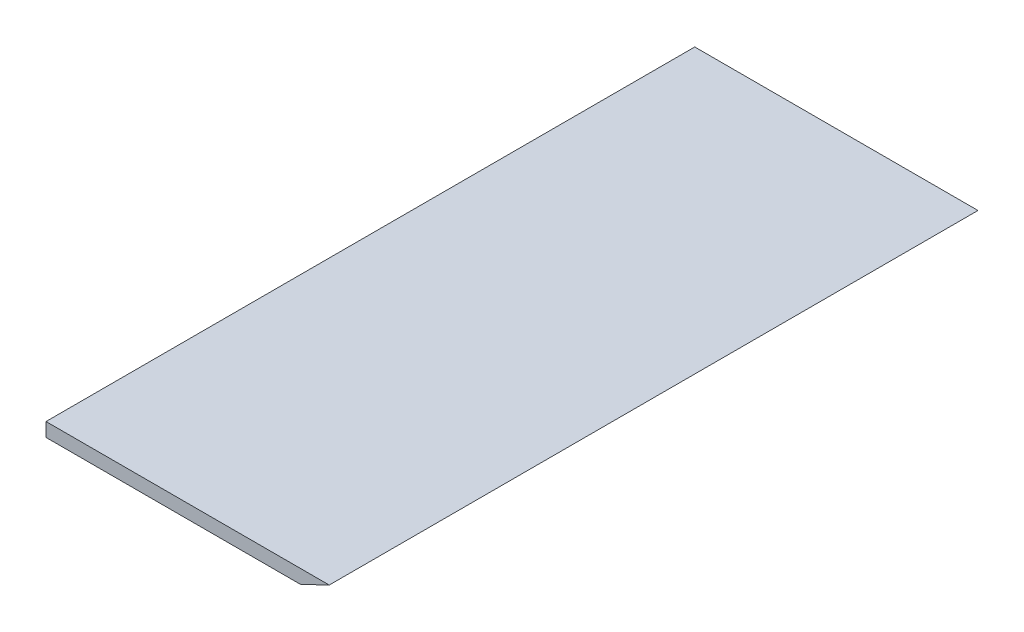
ISO-10303-21;
HEADER;
FILE_DESCRIPTION(('STEP AP214'),'2;1');
FILE_NAME('part.step','',(''),(''),'','','');
FILE_SCHEMA(('AUTOMOTIVE_DESIGN { 1 0 10303 214 1 1 1 1 }'));
ENDSEC;
DATA;
#1=APPLICATION_CONTEXT('core data for automotive mechanical design processes');
#2=APPLICATION_PROTOCOL_DEFINITION('international standard','automotive_design',2000,#1);
#3=PRODUCT_CONTEXT('',#1,'mechanical');
#4=PRODUCT('Part','Part','',(#3));
#5=PRODUCT_RELATED_PRODUCT_CATEGORY('part','',(#4));
#6=PRODUCT_DEFINITION_FORMATION('','',#4);
#7=PRODUCT_DEFINITION_CONTEXT('part definition',#1,'design');
#8=PRODUCT_DEFINITION('design','',#6,#7);
#9=PRODUCT_DEFINITION_SHAPE('','',#8);
#10=(LENGTH_UNIT() NAMED_UNIT(*) SI_UNIT(.MILLI.,.METRE.));
#11=(NAMED_UNIT(*) PLANE_ANGLE_UNIT() SI_UNIT($,.RADIAN.));
#12=(NAMED_UNIT(*) SI_UNIT($,.STERADIAN.) SOLID_ANGLE_UNIT());
#13=UNCERTAINTY_MEASURE_WITH_UNIT(LENGTH_MEASURE(1.E-05),#10,'distance_accuracy_value','');
#14=(GEOMETRIC_REPRESENTATION_CONTEXT(3) GLOBAL_UNCERTAINTY_ASSIGNED_CONTEXT((#13)) GLOBAL_UNIT_ASSIGNED_CONTEXT((#10,
#11,#12)) REPRESENTATION_CONTEXT('',''));
#15=CARTESIAN_POINT('',(0.,0.,0.));
#16=DIRECTION('',(0.,0.,1.));
#17=DIRECTION('',(1.,0.,0.));
#18=AXIS2_PLACEMENT_3D('',#15,#16,#17);
#19=CARTESIAN_POINT('',(0.,0.,298.45));
#20=DIRECTION('',(1.,0.,0.));
#21=DIRECTION('',(0.,0.,-1.));
#22=AXIS2_PLACEMENT_3D('',#19,#20,#21);
#23=PLANE('',#22);
#24=DIRECTION('',(0.,-1.,0.));
#25=VECTOR('',#24,1.);
#26=CARTESIAN_POINT('',(0.,0.,0.));
#27=LINE('',#26,#25);
#28=CARTESIAN_POINT('',(0.,6.35,0.));
#29=VERTEX_POINT('',#28);
#30=CARTESIAN_POINT('',(0.,0.,0.));
#31=VERTEX_POINT('',#30);
#32=EDGE_CURVE('E96',#29,#31,#27,.T.);
#33=ORIENTED_EDGE('',*,*,#32,.T.);
#34=DIRECTION('',(0.,0.,-1.));
#35=VECTOR('',#34,1.);
#36=CARTESIAN_POINT('',(0.,0.,298.45));
#37=LINE('',#36,#35);
#38=CARTESIAN_POINT('',(0.,0.,298.45));
#39=VERTEX_POINT('',#38);
#40=EDGE_CURVE('E11',#39,#31,#37,.T.);
#41=ORIENTED_EDGE('',*,*,#40,.F.);
#42=DIRECTION('',(0.,-1.,0.));
#43=VECTOR('',#42,1.);
#44=CARTESIAN_POINT('',(0.,0.,298.45));
#45=LINE('',#44,#43);
#46=CARTESIAN_POINT('',(0.,6.35,298.45));
#47=VERTEX_POINT('',#46);
#48=EDGE_CURVE('E84',#47,#39,#45,.T.);
#49=ORIENTED_EDGE('',*,*,#48,.F.);
#50=DIRECTION('',(0.,0.,-1.));
#51=VECTOR('',#50,1.);
#52=CARTESIAN_POINT('',(0.,6.35,298.45));
#53=LINE('',#52,#51);
#54=EDGE_CURVE('E92',#47,#29,#53,.T.);
#55=ORIENTED_EDGE('',*,*,#54,.T.);
#56=EDGE_LOOP('',(#33,#41,#49,#55));
#57=FACE_BOUND('',#56,.T.);
#58=ADVANCED_FACE('F33',(#57),#23,.F.);
#59=CARTESIAN_POINT('',(0.,0.,298.45));
#60=DIRECTION('',(0.,1.,0.));
#61=DIRECTION('',(0.,0.,1.));
#62=AXIS2_PLACEMENT_3D('',#59,#60,#61);
#63=PLANE('',#62);
#64=DIRECTION('',(1.,0.,0.));
#65=VECTOR('',#64,1.);
#66=CARTESIAN_POINT('',(0.,0.,0.));
#67=LINE('',#66,#65);
#68=CARTESIAN_POINT('',(117.094,0.,0.));
#69=VERTEX_POINT('',#68);
#70=EDGE_CURVE('E88',#31,#69,#67,.T.);
#71=ORIENTED_EDGE('',*,*,#70,.T.);
#72=DIRECTION('',(0.,0.,-1.));
#73=VECTOR('',#72,1.);
#74=CARTESIAN_POINT('',(117.094,0.,298.45));
#75=LINE('',#74,#73);
#76=CARTESIAN_POINT('',(117.094,0.,298.45));
#77=VERTEX_POINT('',#76);
#78=EDGE_CURVE('E41',#77,#69,#75,.T.);
#79=ORIENTED_EDGE('',*,*,#78,.F.);
#80=DIRECTION('',(1.,0.,0.));
#81=VECTOR('',#80,1.);
#82=CARTESIAN_POINT('',(0.,0.,298.45));
#83=LINE('',#82,#81);
#84=EDGE_CURVE('E79',#39,#77,#83,.T.);
#85=ORIENTED_EDGE('',*,*,#84,.F.);
#86=ORIENTED_EDGE('',*,*,#40,.T.);
#87=EDGE_LOOP('',(#71,#79,#85,#86));
#88=FACE_BOUND('',#87,.T.);
#89=ADVANCED_FACE('F87',(#88),#63,.F.);
#90=CARTESIAN_POINT('',(130.302,6.35,298.45));
#91=DIRECTION('',(-0.433294434867878,0.901252424525186,0.));
#92=DIRECTION('',(-0.901252424525186,-0.433294434867878,0.));
#93=AXIS2_PLACEMENT_3D('',#90,#91,#92);
#94=PLANE('',#93);
#95=DIRECTION('',(0.901252424525186,0.433294434867878,0.));
#96=VECTOR('',#95,1.);
#97=CARTESIAN_POINT('',(130.302,6.35,0.));
#98=LINE('',#97,#96);
#99=CARTESIAN_POINT('',(130.302,6.35,0.));
#100=VERTEX_POINT('',#99);
#101=EDGE_CURVE('E66',#69,#100,#98,.T.);
#102=ORIENTED_EDGE('',*,*,#101,.T.);
#103=DIRECTION('',(0.,0.,-1.));
#104=VECTOR('',#103,1.);
#105=CARTESIAN_POINT('',(130.302,6.35,298.45));
#106=LINE('',#105,#104);
#107=CARTESIAN_POINT('',(130.302,6.35,298.45));
#108=VERTEX_POINT('',#107);
#109=EDGE_CURVE('E89',#108,#100,#106,.T.);
#110=ORIENTED_EDGE('',*,*,#109,.F.);
#111=DIRECTION('',(0.901252424525186,0.433294434867878,0.));
#112=VECTOR('',#111,1.);
#113=CARTESIAN_POINT('',(130.302,6.35,298.45));
#114=LINE('',#113,#112);
#115=EDGE_CURVE('E82',#77,#108,#114,.T.);
#116=ORIENTED_EDGE('',*,*,#115,.F.);
#117=ORIENTED_EDGE('',*,*,#78,.T.);
#118=EDGE_LOOP('',(#102,#110,#116,#117));
#119=FACE_BOUND('',#118,.T.);
#120=ADVANCED_FACE('F90',(#119),#94,.F.);
#121=CARTESIAN_POINT('',(0.,6.35,298.45));
#122=DIRECTION('',(0.,-1.,0.));
#123=DIRECTION('',(0.,0.,-1.));
#124=AXIS2_PLACEMENT_3D('',#121,#122,#123);
#125=PLANE('',#124);
#126=DIRECTION('',(-1.,0.,0.));
#127=VECTOR('',#126,1.);
#128=CARTESIAN_POINT('',(0.,6.35,0.));
#129=LINE('',#128,#127);
#130=EDGE_CURVE('E72',#100,#29,#129,.T.);
#131=ORIENTED_EDGE('',*,*,#130,.T.);
#132=ORIENTED_EDGE('',*,*,#54,.F.);
#133=DIRECTION('',(-1.,0.,0.));
#134=VECTOR('',#133,1.);
#135=CARTESIAN_POINT('',(0.,6.35,298.45));
#136=LINE('',#135,#134);
#137=EDGE_CURVE('E49',#108,#47,#136,.T.);
#138=ORIENTED_EDGE('',*,*,#137,.F.);
#139=ORIENTED_EDGE('',*,*,#109,.T.);
#140=EDGE_LOOP('',(#131,#132,#138,#139));
#141=FACE_BOUND('',#140,.T.);
#142=ADVANCED_FACE('F103',(#141),#125,.F.);
#143=CARTESIAN_POINT('',(0.,0.,298.45));
#144=DIRECTION('',(0.,0.,-1.));
#145=DIRECTION('',(-1.,0.,0.));
#146=AXIS2_PLACEMENT_3D('',#143,#144,#145);
#147=PLANE('',#146);
#148=ORIENTED_EDGE('',*,*,#48,.T.);
#149=ORIENTED_EDGE('',*,*,#84,.T.);
#150=ORIENTED_EDGE('',*,*,#115,.T.);
#151=ORIENTED_EDGE('',*,*,#137,.T.);
#152=EDGE_LOOP('',(#148,#149,#150,#151));
#153=FACE_BOUND('',#152,.T.);
#154=ADVANCED_FACE('F80',(#153),#147,.F.);
#155=CARTESIAN_POINT('',(0.,0.,0.));
#156=DIRECTION('',(0.,0.,-1.));
#157=DIRECTION('',(-1.,0.,0.));
#158=AXIS2_PLACEMENT_3D('',#155,#156,#157);
#159=PLANE('',#158);
#160=ORIENTED_EDGE('',*,*,#32,.F.);
#161=ORIENTED_EDGE('',*,*,#130,.F.);
#162=ORIENTED_EDGE('',*,*,#101,.F.);
#163=ORIENTED_EDGE('',*,*,#70,.F.);
#164=EDGE_LOOP('',(#160,#161,#162,#163));
#165=FACE_BOUND('',#164,.T.);
#166=ADVANCED_FACE('F106',(#165),#159,.T.);
#167=CLOSED_SHELL('',(#58,#89,#120,#142,#154,#166));
#168=MANIFOLD_SOLID_BREP('B2',#167);
#169=ADVANCED_BREP_SHAPE_REPRESENTATION('',(#18,#168),#14);
#170=SHAPE_DEFINITION_REPRESENTATION(#9,#169);
ENDSEC;
END-ISO-10303-21;
